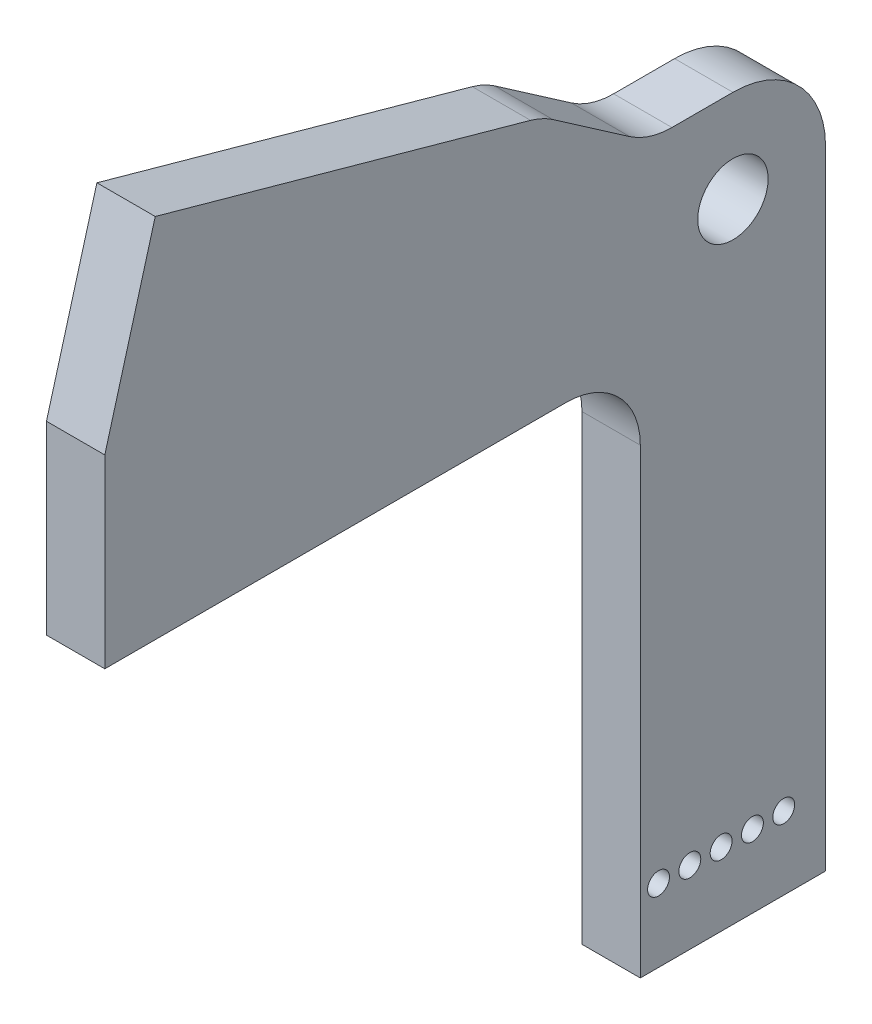
ISO-10303-21;
HEADER;
FILE_DESCRIPTION(('STEP AP214'),'2;1');
FILE_NAME('part.step','',(''),(''),'','','');
FILE_SCHEMA(('AUTOMOTIVE_DESIGN { 1 0 10303 214 1 1 1 1 }'));
ENDSEC;
DATA;
#1=APPLICATION_CONTEXT('core data for automotive mechanical design processes');
#2=APPLICATION_PROTOCOL_DEFINITION('international standard','automotive_design',2000,#1);
#3=PRODUCT_CONTEXT('',#1,'mechanical');
#4=PRODUCT('Part','Part','',(#3));
#5=PRODUCT_RELATED_PRODUCT_CATEGORY('part','',(#4));
#6=PRODUCT_DEFINITION_FORMATION('','',#4);
#7=PRODUCT_DEFINITION_CONTEXT('part definition',#1,'design');
#8=PRODUCT_DEFINITION('design','',#6,#7);
#9=PRODUCT_DEFINITION_SHAPE('','',#8);
#10=(LENGTH_UNIT() NAMED_UNIT(*) SI_UNIT(.MILLI.,.METRE.));
#11=(NAMED_UNIT(*) PLANE_ANGLE_UNIT() SI_UNIT($,.RADIAN.));
#12=(NAMED_UNIT(*) SI_UNIT($,.STERADIAN.) SOLID_ANGLE_UNIT());
#13=UNCERTAINTY_MEASURE_WITH_UNIT(LENGTH_MEASURE(1.E-05),#10,'distance_accuracy_value','');
#14=(GEOMETRIC_REPRESENTATION_CONTEXT(3) GLOBAL_UNCERTAINTY_ASSIGNED_CONTEXT((#13)) GLOBAL_UNIT_ASSIGNED_CONTEXT((#10,
#11,#12)) REPRESENTATION_CONTEXT('',''));
#15=CARTESIAN_POINT('',(0.,0.,0.));
#16=DIRECTION('',(0.,0.,1.));
#17=DIRECTION('',(1.,0.,0.));
#18=AXIS2_PLACEMENT_3D('',#15,#16,#17);
#19=CARTESIAN_POINT('',(2.,1.59130853302584,-1.10220376454605));
#20=DIRECTION('',(0.,0.8220643664474,-0.569394570941306));
#21=DIRECTION('',(0.,0.569394570941306,0.8220643664474));
#22=AXIS2_PLACEMENT_3D('',#19,#20,#21);
#23=PLANE('',#22);
#24=DIRECTION('',(0.,-0.569394570941306,-0.8220643664474));
#25=VECTOR('',#24,1.);
#26=CARTESIAN_POINT('',(-2.,1.59130853302584,-1.10220376454605));
#27=LINE('',#26,#25);
#28=CARTESIAN_POINT('',(-2.,10.9025666005929,12.3409406818238));
#29=VERTEX_POINT('',#28);
#30=CARTESIAN_POINT('',(-2.,7.2539130184472,7.07319095524302));
#31=VERTEX_POINT('',#30);
#32=EDGE_CURVE('E178',#29,#31,#27,.T.);
#33=ORIENTED_EDGE('',*,*,#32,.F.);
#34=DIRECTION('',(-1.,0.,0.));
#35=VECTOR('',#34,1.);
#36=CARTESIAN_POINT('',(2.,10.9025666005929,12.3409406818238));
#37=LINE('',#36,#35);
#38=CARTESIAN_POINT('',(2.,10.9025666005929,12.3409406818238));
#39=VERTEX_POINT('',#38);
#40=EDGE_CURVE('E11',#39,#29,#37,.T.);
#41=ORIENTED_EDGE('',*,*,#40,.F.);
#42=DIRECTION('',(0.,-0.569394570941306,-0.8220643664474));
#43=VECTOR('',#42,1.);
#44=CARTESIAN_POINT('',(2.,1.59130853302584,-1.10220376454605));
#45=LINE('',#44,#43);
#46=CARTESIAN_POINT('',(2.,7.2539130184472,7.07319095524302));
#47=VERTEX_POINT('',#46);
#48=EDGE_CURVE('E255',#39,#47,#45,.T.);
#49=ORIENTED_EDGE('',*,*,#48,.T.);
#50=DIRECTION('',(-1.,0.,0.));
#51=VECTOR('',#50,1.);
#52=CARTESIAN_POINT('',(2.,7.2539130184472,7.07319095524302));
#53=LINE('',#52,#51);
#54=EDGE_CURVE('E101',#47,#31,#53,.T.);
#55=ORIENTED_EDGE('',*,*,#54,.T.);
#56=EDGE_LOOP('',(#33,#41,#49,#55));
#57=FACE_BOUND('',#56,.T.);
#58=ADVANCED_FACE('F35',(#57),#23,.T.);
#59=CARTESIAN_POINT('',(2.,6.72647961904014,15.2334651022057));
#60=DIRECTION('',(-1.,0.,0.));
#61=DIRECTION('',(0.,0.,1.));
#62=AXIS2_PLACEMENT_3D('',#59,#60,#61);
#63=CYLINDRICAL_SURFACE('',#62,5.08);
#64=CARTESIAN_POINT('',(-2.,6.72647961904014,15.2334651022057));
#65=DIRECTION('',(1.,0.,0.));
#66=DIRECTION('',(0.,0.,-1.));
#67=AXIS2_PLACEMENT_3D('',#64,#65,#66);
#68=CIRCLE('',#67,5.08);
#69=CARTESIAN_POINT('',(-2.,11.6206352142722,13.8719802474757));
#70=VERTEX_POINT('',#69);
#71=EDGE_CURVE('E181',#29,#70,#68,.T.);
#72=ORIENTED_EDGE('',*,*,#71,.T.);
#73=DIRECTION('',(-1.,0.,0.));
#74=VECTOR('',#73,1.);
#75=CARTESIAN_POINT('',(2.,11.6206352142722,13.8719802474757));
#76=LINE('',#75,#74);
#77=CARTESIAN_POINT('',(2.,11.6206352142722,13.8719802474757));
#78=VERTEX_POINT('',#77);
#79=EDGE_CURVE('E44',#78,#70,#76,.T.);
#80=ORIENTED_EDGE('',*,*,#79,.F.);
#81=CARTESIAN_POINT('',(2.,6.72647961904014,15.2334651022057));
#82=DIRECTION('',(1.,0.,0.));
#83=DIRECTION('',(0.,0.,-1.));
#84=AXIS2_PLACEMENT_3D('',#81,#82,#83);
#85=CIRCLE('',#84,5.08);
#86=EDGE_CURVE('E251',#39,#78,#85,.T.);
#87=ORIENTED_EDGE('',*,*,#86,.F.);
#88=ORIENTED_EDGE('',*,*,#40,.T.);
#89=EDGE_LOOP('',(#72,#80,#87,#88));
#90=FACE_BOUND('',#89,.T.);
#91=ADVANCED_FACE('F239',(#90),#63,.T.);
#92=CARTESIAN_POINT('',(2.,7.20413730474607,-2.00408908972212));
#93=DIRECTION('',(0.,0.963416455754335,-0.268008829671254));
#94=DIRECTION('',(0.,0.268008829671254,0.963416455754335));
#95=AXIS2_PLACEMENT_3D('',#92,#93,#94);
#96=PLANE('',#95);
#97=DIRECTION('',(0.,-0.268008829671254,-0.963416455754335));
#98=VECTOR('',#97,1.);
#99=CARTESIAN_POINT('',(-2.,7.20413730474607,-2.00408908972212));
#100=LINE('',#99,#98);
#101=CARTESIAN_POINT('',(-2.,18.7801066646962,39.6082689298396));
#102=VERTEX_POINT('',#101);
#103=EDGE_CURVE('E184',#102,#70,#100,.T.);
#104=ORIENTED_EDGE('',*,*,#103,.F.);
#105=DIRECTION('',(-1.,0.,0.));
#106=VECTOR('',#105,1.);
#107=CARTESIAN_POINT('',(2.,18.7801066646962,39.6082689298396));
#108=LINE('',#107,#106);
#109=CARTESIAN_POINT('',(2.,18.7801066646962,39.6082689298396));
#110=VERTEX_POINT('',#109);
#111=EDGE_CURVE('E229',#110,#102,#108,.T.);
#112=ORIENTED_EDGE('',*,*,#111,.F.);
#113=DIRECTION('',(0.,-0.268008829671254,-0.963416455754335));
#114=VECTOR('',#113,1.);
#115=CARTESIAN_POINT('',(2.,7.20413730474607,-2.00408908972212));
#116=LINE('',#115,#114);
#117=EDGE_CURVE('E236',#110,#78,#116,.T.);
#118=ORIENTED_EDGE('',*,*,#117,.T.);
#119=ORIENTED_EDGE('',*,*,#79,.T.);
#120=EDGE_LOOP('',(#104,#112,#118,#119));
#121=FACE_BOUND('',#120,.T.);
#122=ADVANCED_FACE('F234',(#121),#96,.T.);
#123=CARTESIAN_POINT('',(2.,11.5759693599502,41.6123580195617));
#124=DIRECTION('',(0.,0.268008829671254,0.963416455754335));
#125=DIRECTION('',(0.,-0.963416455754335,0.268008829671254));
#126=AXIS2_PLACEMENT_3D('',#123,#124,#125);
#127=PLANE('',#126);
#128=DIRECTION('',(0.,0.963416455754335,-0.268008829671254));
#129=VECTOR('',#128,1.);
#130=CARTESIAN_POINT('',(-2.,11.5759693599502,41.6123580195617));
#131=LINE('',#130,#129);
#132=CARTESIAN_POINT('',(-2.,6.35,43.0661487698572));
#133=VERTEX_POINT('',#132);
#134=EDGE_CURVE('E187',#133,#102,#131,.T.);
#135=ORIENTED_EDGE('',*,*,#134,.F.);
#136=DIRECTION('',(-1.,0.,0.));
#137=VECTOR('',#136,1.);
#138=CARTESIAN_POINT('',(2.,6.35,43.0661487698572));
#139=LINE('',#138,#137);
#140=CARTESIAN_POINT('',(2.,6.35,43.0661487698572));
#141=VERTEX_POINT('',#140);
#142=EDGE_CURVE('E227',#141,#133,#139,.T.);
#143=ORIENTED_EDGE('',*,*,#142,.F.);
#144=DIRECTION('',(0.,0.963416455754335,-0.268008829671254));
#145=VECTOR('',#144,1.);
#146=CARTESIAN_POINT('',(2.,11.5759693599502,41.6123580195617));
#147=LINE('',#146,#145);
#148=EDGE_CURVE('E248',#141,#110,#147,.T.);
#149=ORIENTED_EDGE('',*,*,#148,.T.);
#150=ORIENTED_EDGE('',*,*,#111,.T.);
#151=EDGE_LOOP('',(#135,#143,#149,#150));
#152=FACE_BOUND('',#151,.T.);
#153=ADVANCED_FACE('F245',(#152),#127,.T.);
#154=CARTESIAN_POINT('',(2.,0.,43.0661487698572));
#155=DIRECTION('',(0.,0.,1.));
#156=DIRECTION('',(1.,0.,0.));
#157=AXIS2_PLACEMENT_3D('',#154,#155,#156);
#158=PLANE('',#157);
#159=DIRECTION('',(0.,1.,0.));
#160=VECTOR('',#159,1.);
#161=CARTESIAN_POINT('',(-2.,0.,43.0661487698572));
#162=LINE('',#161,#160);
#163=CARTESIAN_POINT('',(-2.,-6.35,43.0661487698572));
#164=VERTEX_POINT('',#163);
#165=EDGE_CURVE('E190',#164,#133,#162,.T.);
#166=ORIENTED_EDGE('',*,*,#165,.F.);
#167=DIRECTION('',(-1.,0.,0.));
#168=VECTOR('',#167,1.);
#169=CARTESIAN_POINT('',(2.,-6.35,43.0661487698572));
#170=LINE('',#169,#168);
#171=CARTESIAN_POINT('',(2.,-6.35,43.0661487698572));
#172=VERTEX_POINT('',#171);
#173=EDGE_CURVE('E225',#172,#164,#170,.T.);
#174=ORIENTED_EDGE('',*,*,#173,.F.);
#175=DIRECTION('',(0.,1.,0.));
#176=VECTOR('',#175,1.);
#177=CARTESIAN_POINT('',(2.,0.,43.0661487698572));
#178=LINE('',#177,#176);
#179=EDGE_CURVE('E253',#172,#141,#178,.T.);
#180=ORIENTED_EDGE('',*,*,#179,.T.);
#181=ORIENTED_EDGE('',*,*,#142,.T.);
#182=EDGE_LOOP('',(#166,#174,#180,#181));
#183=FACE_BOUND('',#182,.T.);
#184=ADVANCED_FACE('F386',(#183),#158,.T.);
#185=CARTESIAN_POINT('',(2.,-6.35,0.));
#186=DIRECTION('',(0.,-1.,0.));
#187=DIRECTION('',(0.,0.,-1.));
#188=AXIS2_PLACEMENT_3D('',#185,#186,#187);
#189=PLANE('',#188);
#190=DIRECTION('',(0.,0.,1.));
#191=VECTOR('',#190,1.);
#192=CARTESIAN_POINT('',(-2.,-6.35,0.));
#193=LINE('',#192,#191);
#194=CARTESIAN_POINT('',(-2.,-6.35,11.43));
#195=VERTEX_POINT('',#194);
#196=EDGE_CURVE('E193',#195,#164,#193,.T.);
#197=ORIENTED_EDGE('',*,*,#196,.F.);
#198=DIRECTION('',(-1.,0.,0.));
#199=VECTOR('',#198,1.);
#200=CARTESIAN_POINT('',(2.,-6.35,11.43));
#201=LINE('',#200,#199);
#202=CARTESIAN_POINT('',(2.,-6.35,11.43));
#203=VERTEX_POINT('',#202);
#204=EDGE_CURVE('E223',#203,#195,#201,.T.);
#205=ORIENTED_EDGE('',*,*,#204,.F.);
#206=DIRECTION('',(0.,0.,1.));
#207=VECTOR('',#206,1.);
#208=CARTESIAN_POINT('',(2.,-6.35,0.));
#209=LINE('',#208,#207);
#210=EDGE_CURVE('E260',#203,#172,#209,.T.);
#211=ORIENTED_EDGE('',*,*,#210,.T.);
#212=ORIENTED_EDGE('',*,*,#173,.T.);
#213=EDGE_LOOP('',(#197,#205,#211,#212));
#214=FACE_BOUND('',#213,.T.);
#215=ADVANCED_FACE('F382',(#214),#189,.T.);
#216=CARTESIAN_POINT('',(2.,-11.43,11.43));
#217=DIRECTION('',(-1.,0.,0.));
#218=DIRECTION('',(0.,0.,1.));
#219=AXIS2_PLACEMENT_3D('',#216,#217,#218);
#220=CYLINDRICAL_SURFACE('',#219,5.08);
#221=CARTESIAN_POINT('',(-2.,-11.43,11.43));
#222=DIRECTION('',(1.,0.,0.));
#223=DIRECTION('',(0.,0.,-1.));
#224=AXIS2_PLACEMENT_3D('',#221,#222,#223);
#225=CIRCLE('',#224,5.08);
#226=CARTESIAN_POINT('',(-2.,-11.43,6.35));
#227=VERTEX_POINT('',#226);
#228=EDGE_CURVE('E196',#227,#195,#225,.T.);
#229=ORIENTED_EDGE('',*,*,#228,.F.);
#230=DIRECTION('',(-1.,0.,0.));
#231=VECTOR('',#230,1.);
#232=CARTESIAN_POINT('',(2.,-11.43,6.35));
#233=LINE('',#232,#231);
#234=CARTESIAN_POINT('',(2.,-11.43,6.35));
#235=VERTEX_POINT('',#234);
#236=EDGE_CURVE('E221',#235,#227,#233,.T.);
#237=ORIENTED_EDGE('',*,*,#236,.F.);
#238=CARTESIAN_POINT('',(2.,-11.43,11.43));
#239=DIRECTION('',(1.,0.,0.));
#240=DIRECTION('',(0.,0.,-1.));
#241=AXIS2_PLACEMENT_3D('',#238,#239,#240);
#242=CIRCLE('',#241,5.08);
#243=EDGE_CURVE('E263',#235,#203,#242,.T.);
#244=ORIENTED_EDGE('',*,*,#243,.T.);
#245=ORIENTED_EDGE('',*,*,#204,.T.);
#246=EDGE_LOOP('',(#229,#237,#244,#245));
#247=FACE_BOUND('',#246,.T.);
#248=ADVANCED_FACE('F378',(#247),#220,.F.);
#249=CARTESIAN_POINT('',(2.,0.,6.35));
#250=DIRECTION('',(0.,0.,1.));
#251=DIRECTION('',(1.,0.,0.));
#252=AXIS2_PLACEMENT_3D('',#249,#250,#251);
#253=PLANE('',#252);
#254=DIRECTION('',(0.,1.,0.));
#255=VECTOR('',#254,1.);
#256=CARTESIAN_POINT('',(-2.,0.,6.35));
#257=LINE('',#256,#255);
#258=CARTESIAN_POINT('',(-2.,-43.0661487698572,6.35));
#259=VERTEX_POINT('',#258);
#260=EDGE_CURVE('E199',#259,#227,#257,.T.);
#261=ORIENTED_EDGE('',*,*,#260,.F.);
#262=DIRECTION('',(-1.,0.,0.));
#263=VECTOR('',#262,1.);
#264=CARTESIAN_POINT('',(2.,-43.0661487698572,6.35));
#265=LINE('',#264,#263);
#266=CARTESIAN_POINT('',(2.,-43.0661487698572,6.35));
#267=VERTEX_POINT('',#266);
#268=EDGE_CURVE('E219',#267,#259,#265,.T.);
#269=ORIENTED_EDGE('',*,*,#268,.F.);
#270=DIRECTION('',(0.,1.,0.));
#271=VECTOR('',#270,1.);
#272=CARTESIAN_POINT('',(2.,0.,6.35));
#273=LINE('',#272,#271);
#274=EDGE_CURVE('E266',#267,#235,#273,.T.);
#275=ORIENTED_EDGE('',*,*,#274,.T.);
#276=ORIENTED_EDGE('',*,*,#236,.T.);
#277=EDGE_LOOP('',(#261,#269,#275,#276));
#278=FACE_BOUND('',#277,.T.);
#279=ADVANCED_FACE('F374',(#278),#253,.T.);
#280=CARTESIAN_POINT('',(2.,-43.0661487698572,0.));
#281=DIRECTION('',(0.,-1.,0.));
#282=DIRECTION('',(0.,0.,-1.));
#283=AXIS2_PLACEMENT_3D('',#280,#281,#282);
#284=PLANE('',#283);
#285=DIRECTION('',(0.,0.,1.));
#286=VECTOR('',#285,1.);
#287=CARTESIAN_POINT('',(-2.,-43.0661487698572,0.));
#288=LINE('',#287,#286);
#289=CARTESIAN_POINT('',(-2.,-43.0661487698572,-6.35));
#290=VERTEX_POINT('',#289);
#291=EDGE_CURVE('E202',#290,#259,#288,.T.);
#292=ORIENTED_EDGE('',*,*,#291,.F.);
#293=DIRECTION('',(-1.,0.,0.));
#294=VECTOR('',#293,1.);
#295=CARTESIAN_POINT('',(2.,-43.0661487698572,-6.35));
#296=LINE('',#295,#294);
#297=CARTESIAN_POINT('',(2.,-43.0661487698572,-6.35));
#298=VERTEX_POINT('',#297);
#299=EDGE_CURVE('E217',#298,#290,#296,.T.);
#300=ORIENTED_EDGE('',*,*,#299,.F.);
#301=DIRECTION('',(0.,0.,1.));
#302=VECTOR('',#301,1.);
#303=CARTESIAN_POINT('',(2.,-43.0661487698572,0.));
#304=LINE('',#303,#302);
#305=EDGE_CURVE('E269',#298,#267,#304,.T.);
#306=ORIENTED_EDGE('',*,*,#305,.T.);
#307=ORIENTED_EDGE('',*,*,#268,.T.);
#308=EDGE_LOOP('',(#292,#300,#306,#307));
#309=FACE_BOUND('',#308,.T.);
#310=ADVANCED_FACE('F371',(#309),#284,.T.);
#311=CARTESIAN_POINT('',(2.,0.,-6.35));
#312=DIRECTION('',(0.,0.,-1.));
#313=DIRECTION('',(0.,1.,0.));
#314=AXIS2_PLACEMENT_3D('',#311,#312,#313);
#315=PLANE('',#314);
#316=DIRECTION('',(0.,-1.,0.));
#317=VECTOR('',#316,1.);
#318=CARTESIAN_POINT('',(-2.,0.,-6.35));
#319=LINE('',#318,#317);
#320=CARTESIAN_POINT('',(-2.,0.,-6.35));
#321=VERTEX_POINT('',#320);
#322=EDGE_CURVE('E205',#321,#290,#319,.T.);
#323=ORIENTED_EDGE('',*,*,#322,.F.);
#324=DIRECTION('',(-1.,0.,0.));
#325=VECTOR('',#324,1.);
#326=CARTESIAN_POINT('',(2.,0.,-6.35));
#327=LINE('',#326,#325);
#328=CARTESIAN_POINT('',(2.,0.,-6.35));
#329=VERTEX_POINT('',#328);
#330=EDGE_CURVE('E146',#329,#321,#327,.T.);
#331=ORIENTED_EDGE('',*,*,#330,.F.);
#332=DIRECTION('',(0.,-1.,0.));
#333=VECTOR('',#332,1.);
#334=CARTESIAN_POINT('',(2.,0.,-6.35));
#335=LINE('',#334,#333);
#336=EDGE_CURVE('E153',#329,#298,#335,.T.);
#337=ORIENTED_EDGE('',*,*,#336,.T.);
#338=ORIENTED_EDGE('',*,*,#299,.T.);
#339=EDGE_LOOP('',(#323,#331,#337,#338));
#340=FACE_BOUND('',#339,.T.);
#341=ADVANCED_FACE('F273',(#340),#315,.T.);
#342=CARTESIAN_POINT('',(2.,0.,0.));
#343=DIRECTION('',(-1.,0.,0.));
#344=DIRECTION('',(0.,0.,1.));
#345=AXIS2_PLACEMENT_3D('',#342,#343,#344);
#346=CYLINDRICAL_SURFACE('',#345,6.35);
#347=CARTESIAN_POINT('',(-2.,0.,0.));
#348=DIRECTION('',(1.,0.,0.));
#349=DIRECTION('',(0.,0.,-1.));
#350=AXIS2_PLACEMENT_3D('',#347,#348,#349);
#351=CIRCLE('',#350,6.35);
#352=CARTESIAN_POINT('',(-2.,6.35,0.));
#353=VERTEX_POINT('',#352);
#354=EDGE_CURVE('E141',#353,#321,#351,.F.);
#355=ORIENTED_EDGE('',*,*,#354,.F.);
#356=DIRECTION('',(-1.,0.,0.));
#357=VECTOR('',#356,1.);
#358=CARTESIAN_POINT('',(2.,6.35,0.));
#359=LINE('',#358,#357);
#360=CARTESIAN_POINT('',(2.,6.35,0.));
#361=VERTEX_POINT('',#360);
#362=EDGE_CURVE('E136',#361,#353,#359,.T.);
#363=ORIENTED_EDGE('',*,*,#362,.F.);
#364=CARTESIAN_POINT('',(2.,0.,0.));
#365=DIRECTION('',(1.,0.,0.));
#366=DIRECTION('',(0.,0.,-1.));
#367=AXIS2_PLACEMENT_3D('',#364,#365,#366);
#368=CIRCLE('',#367,6.35);
#369=EDGE_CURVE('E139',#361,#329,#368,.F.);
#370=ORIENTED_EDGE('',*,*,#369,.T.);
#371=ORIENTED_EDGE('',*,*,#330,.T.);
#372=EDGE_LOOP('',(#355,#363,#370,#371));
#373=FACE_BOUND('',#372,.T.);
#374=ADVANCED_FACE('F138',(#373),#346,.T.);
#375=CARTESIAN_POINT('',(2.,6.35,0.));
#376=DIRECTION('',(0.,1.,0.));
#377=DIRECTION('',(0.,0.,1.));
#378=AXIS2_PLACEMENT_3D('',#375,#376,#377);
#379=PLANE('',#378);
#380=DIRECTION('',(0.,0.,-1.));
#381=VECTOR('',#380,1.);
#382=CARTESIAN_POINT('',(-2.,6.35,0.));
#383=LINE('',#382,#381);
#384=CARTESIAN_POINT('',(-2.,6.35,4.18066653486117));
#385=VERTEX_POINT('',#384);
#386=EDGE_CURVE('E209',#385,#353,#383,.T.);
#387=ORIENTED_EDGE('',*,*,#386,.F.);
#388=DIRECTION('',(-1.,0.,0.));
#389=VECTOR('',#388,1.);
#390=CARTESIAN_POINT('',(2.,6.35,4.18066653486117));
#391=LINE('',#390,#389);
#392=CARTESIAN_POINT('',(2.,6.35,4.18066653486117));
#393=VERTEX_POINT('',#392);
#394=EDGE_CURVE('E94',#393,#385,#391,.T.);
#395=ORIENTED_EDGE('',*,*,#394,.F.);
#396=DIRECTION('',(0.,0.,-1.));
#397=VECTOR('',#396,1.);
#398=CARTESIAN_POINT('',(2.,6.35,0.));
#399=LINE('',#398,#397);
#400=EDGE_CURVE('E150',#393,#361,#399,.T.);
#401=ORIENTED_EDGE('',*,*,#400,.T.);
#402=ORIENTED_EDGE('',*,*,#362,.T.);
#403=EDGE_LOOP('',(#387,#395,#401,#402));
#404=FACE_BOUND('',#403,.T.);
#405=ADVANCED_FACE('F155',(#404),#379,.T.);
#406=CARTESIAN_POINT('',(2.,-38.0661487698572,-3.48181818181819));
#407=DIRECTION('',(-1.,0.,0.));
#408=DIRECTION('',(0.,0.,1.));
#409=AXIS2_PLACEMENT_3D('',#406,#407,#408);
#410=CYLINDRICAL_SURFACE('',#409,0.750000000000001);
#411=CARTESIAN_POINT('',(2.,-38.0661487698572,-3.48181818181819));
#412=DIRECTION('',(1.,0.,0.));
#413=DIRECTION('',(0.,0.,-1.));
#414=AXIS2_PLACEMENT_3D('',#411,#412,#413);
#415=CIRCLE('',#414,0.750000000000001);
#416=CARTESIAN_POINT('',(2.,-38.0661487698572,-4.23181818181819));
#417=VERTEX_POINT('',#416);
#418=EDGE_CURVE('E276',#417,#417,#415,.T.);
#419=ORIENTED_EDGE('',*,*,#418,.T.);
#420=EDGE_LOOP('',(#419));
#421=FACE_BOUND('',#420,.T.);
#422=CARTESIAN_POINT('',(-2.,-38.0661487698572,-3.48181818181819));
#423=DIRECTION('',(1.,0.,0.));
#424=DIRECTION('',(0.,0.,-1.));
#425=AXIS2_PLACEMENT_3D('',#422,#423,#424);
#426=CIRCLE('',#425,0.750000000000001);
#427=CARTESIAN_POINT('',(-2.,-38.0661487698572,-4.23181818181819));
#428=VERTEX_POINT('',#427);
#429=EDGE_CURVE('E175',#428,#428,#426,.T.);
#430=ORIENTED_EDGE('',*,*,#429,.F.);
#431=EDGE_LOOP('',(#430));
#432=FACE_BOUND('',#431,.T.);
#433=ADVANCED_FACE('F310',(#421,#432),#410,.F.);
#434=CARTESIAN_POINT('',(2.,-38.0661487698572,-1.33636363636364));
#435=DIRECTION('',(-1.,0.,0.));
#436=DIRECTION('',(0.,0.,1.));
#437=AXIS2_PLACEMENT_3D('',#434,#435,#436);
#438=CYLINDRICAL_SURFACE('',#437,0.750000000000001);
#439=CARTESIAN_POINT('',(2.,-38.0661487698572,-1.33636363636364));
#440=DIRECTION('',(1.,0.,0.));
#441=DIRECTION('',(0.,0.,-1.));
#442=AXIS2_PLACEMENT_3D('',#439,#440,#441);
#443=CIRCLE('',#442,0.750000000000001);
#444=CARTESIAN_POINT('',(2.,-38.0661487698572,-2.08636363636364));
#445=VERTEX_POINT('',#444);
#446=EDGE_CURVE('E278',#445,#445,#443,.T.);
#447=ORIENTED_EDGE('',*,*,#446,.T.);
#448=EDGE_LOOP('',(#447));
#449=FACE_BOUND('',#448,.T.);
#450=CARTESIAN_POINT('',(-2.,-38.0661487698572,-1.33636363636364));
#451=DIRECTION('',(1.,0.,0.));
#452=DIRECTION('',(0.,0.,-1.));
#453=AXIS2_PLACEMENT_3D('',#450,#451,#452);
#454=CIRCLE('',#453,0.750000000000001);
#455=CARTESIAN_POINT('',(-2.,-38.0661487698572,-2.08636363636364));
#456=VERTEX_POINT('',#455);
#457=EDGE_CURVE('E172',#456,#456,#454,.T.);
#458=ORIENTED_EDGE('',*,*,#457,.F.);
#459=EDGE_LOOP('',(#458));
#460=FACE_BOUND('',#459,.T.);
#461=ADVANCED_FACE('F313',(#449,#460),#438,.F.);
#462=CARTESIAN_POINT('',(2.,-38.0661487698572,0.809090909090904));
#463=DIRECTION('',(-1.,0.,0.));
#464=DIRECTION('',(0.,0.,1.));
#465=AXIS2_PLACEMENT_3D('',#462,#463,#464);
#466=CYLINDRICAL_SURFACE('',#465,0.750000000000001);
#467=CARTESIAN_POINT('',(2.,-38.0661487698572,0.809090909090904));
#468=DIRECTION('',(1.,0.,0.));
#469=DIRECTION('',(0.,0.,-1.));
#470=AXIS2_PLACEMENT_3D('',#467,#468,#469);
#471=CIRCLE('',#470,0.750000000000001);
#472=CARTESIAN_POINT('',(2.,-38.0661487698572,0.0590909090909031));
#473=VERTEX_POINT('',#472);
#474=EDGE_CURVE('E283',#473,#473,#471,.T.);
#475=ORIENTED_EDGE('',*,*,#474,.T.);
#476=EDGE_LOOP('',(#475));
#477=FACE_BOUND('',#476,.T.);
#478=CARTESIAN_POINT('',(-2.,-38.0661487698572,0.809090909090904));
#479=DIRECTION('',(1.,0.,0.));
#480=DIRECTION('',(0.,0.,-1.));
#481=AXIS2_PLACEMENT_3D('',#478,#479,#480);
#482=CIRCLE('',#481,0.750000000000001);
#483=CARTESIAN_POINT('',(-2.,-38.0661487698572,0.0590909090909031));
#484=VERTEX_POINT('',#483);
#485=EDGE_CURVE('E169',#484,#484,#482,.T.);
#486=ORIENTED_EDGE('',*,*,#485,.F.);
#487=EDGE_LOOP('',(#486));
#488=FACE_BOUND('',#487,.T.);
#489=ADVANCED_FACE('F334',(#477,#488),#466,.F.);
#490=CARTESIAN_POINT('',(2.,-38.0661487698572,2.95454545454545));
#491=DIRECTION('',(-1.,0.,0.));
#492=DIRECTION('',(0.,0.,1.));
#493=AXIS2_PLACEMENT_3D('',#490,#491,#492);
#494=CYLINDRICAL_SURFACE('',#493,0.750000000000001);
#495=CARTESIAN_POINT('',(2.,-38.0661487698572,2.95454545454545));
#496=DIRECTION('',(1.,0.,0.));
#497=DIRECTION('',(0.,0.,-1.));
#498=AXIS2_PLACEMENT_3D('',#495,#496,#497);
#499=CIRCLE('',#498,0.750000000000001);
#500=CARTESIAN_POINT('',(2.,-38.0661487698572,2.20454545454545));
#501=VERTEX_POINT('',#500);
#502=EDGE_CURVE('E286',#501,#501,#499,.T.);
#503=ORIENTED_EDGE('',*,*,#502,.T.);
#504=EDGE_LOOP('',(#503));
#505=FACE_BOUND('',#504,.T.);
#506=CARTESIAN_POINT('',(-2.,-38.0661487698572,2.95454545454545));
#507=DIRECTION('',(1.,0.,0.));
#508=DIRECTION('',(0.,0.,-1.));
#509=AXIS2_PLACEMENT_3D('',#506,#507,#508);
#510=CIRCLE('',#509,0.750000000000001);
#511=CARTESIAN_POINT('',(-2.,-38.0661487698572,2.20454545454545));
#512=VERTEX_POINT('',#511);
#513=EDGE_CURVE('E166',#512,#512,#510,.T.);
#514=ORIENTED_EDGE('',*,*,#513,.F.);
#515=EDGE_LOOP('',(#514));
#516=FACE_BOUND('',#515,.T.);
#517=ADVANCED_FACE('F338',(#505,#516),#494,.F.);
#518=CARTESIAN_POINT('',(2.,-38.0661487698572,5.1));
#519=DIRECTION('',(-1.,0.,0.));
#520=DIRECTION('',(0.,0.,1.));
#521=AXIS2_PLACEMENT_3D('',#518,#519,#520);
#522=CYLINDRICAL_SURFACE('',#521,0.750000000000001);
#523=CARTESIAN_POINT('',(2.,-38.0661487698572,5.1));
#524=DIRECTION('',(1.,0.,0.));
#525=DIRECTION('',(0.,0.,-1.));
#526=AXIS2_PLACEMENT_3D('',#523,#524,#525);
#527=CIRCLE('',#526,0.750000000000001);
#528=CARTESIAN_POINT('',(2.,-38.0661487698572,4.34999999999999));
#529=VERTEX_POINT('',#528);
#530=EDGE_CURVE('E289',#529,#529,#527,.T.);
#531=ORIENTED_EDGE('',*,*,#530,.T.);
#532=EDGE_LOOP('',(#531));
#533=FACE_BOUND('',#532,.T.);
#534=CARTESIAN_POINT('',(-2.,-38.0661487698572,5.1));
#535=DIRECTION('',(1.,0.,0.));
#536=DIRECTION('',(0.,0.,-1.));
#537=AXIS2_PLACEMENT_3D('',#534,#535,#536);
#538=CIRCLE('',#537,0.750000000000001);
#539=CARTESIAN_POINT('',(-2.,-38.0661487698572,4.34999999999999));
#540=VERTEX_POINT('',#539);
#541=EDGE_CURVE('E163',#540,#540,#538,.T.);
#542=ORIENTED_EDGE('',*,*,#541,.F.);
#543=EDGE_LOOP('',(#542));
#544=FACE_BOUND('',#543,.T.);
#545=ADVANCED_FACE('F341',(#533,#544),#522,.F.);
#546=CARTESIAN_POINT('',(2.,0.,0.));
#547=DIRECTION('',(-1.,0.,0.));
#548=DIRECTION('',(0.,0.,1.));
#549=AXIS2_PLACEMENT_3D('',#546,#547,#548);
#550=CYLINDRICAL_SURFACE('',#549,2.413);
#551=CARTESIAN_POINT('',(2.,0.,0.));
#552=DIRECTION('',(1.,0.,0.));
#553=DIRECTION('',(0.,0.,-1.));
#554=AXIS2_PLACEMENT_3D('',#551,#552,#553);
#555=CIRCLE('',#554,2.413);
#556=CARTESIAN_POINT('',(2.,0.,-2.413));
#557=VERTEX_POINT('',#556);
#558=EDGE_CURVE('E213',#557,#557,#555,.T.);
#559=ORIENTED_EDGE('',*,*,#558,.T.);
#560=EDGE_LOOP('',(#559));
#561=FACE_BOUND('',#560,.T.);
#562=CARTESIAN_POINT('',(-2.,0.,0.));
#563=DIRECTION('',(1.,0.,0.));
#564=DIRECTION('',(0.,0.,-1.));
#565=AXIS2_PLACEMENT_3D('',#562,#563,#564);
#566=CIRCLE('',#565,2.413);
#567=CARTESIAN_POINT('',(-2.,0.,-2.413));
#568=VERTEX_POINT('',#567);
#569=EDGE_CURVE('E160',#568,#568,#566,.T.);
#570=ORIENTED_EDGE('',*,*,#569,.F.);
#571=EDGE_LOOP('',(#570));
#572=FACE_BOUND('',#571,.T.);
#573=ADVANCED_FACE('F37',(#561,#572),#550,.F.);
#574=CARTESIAN_POINT('',(2.,11.43,4.18066653486119));
#575=DIRECTION('',(-1.,0.,0.));
#576=DIRECTION('',(0.,0.,1.));
#577=AXIS2_PLACEMENT_3D('',#574,#575,#576);
#578=CYLINDRICAL_SURFACE('',#577,5.08);
#579=CARTESIAN_POINT('',(-2.,11.43,4.18066653486119));
#580=DIRECTION('',(1.,0.,0.));
#581=DIRECTION('',(0.,0.,-1.));
#582=AXIS2_PLACEMENT_3D('',#579,#580,#581);
#583=CIRCLE('',#582,5.08);
#584=EDGE_CURVE('E211',#385,#31,#583,.F.);
#585=ORIENTED_EDGE('',*,*,#584,.T.);
#586=ORIENTED_EDGE('',*,*,#54,.F.);
#587=CARTESIAN_POINT('',(2.,11.43,4.18066653486119));
#588=DIRECTION('',(1.,0.,0.));
#589=DIRECTION('',(0.,0.,-1.));
#590=AXIS2_PLACEMENT_3D('',#587,#588,#589);
#591=CIRCLE('',#590,5.08);
#592=EDGE_CURVE('E52',#393,#47,#591,.F.);
#593=ORIENTED_EDGE('',*,*,#592,.F.);
#594=ORIENTED_EDGE('',*,*,#394,.T.);
#595=EDGE_LOOP('',(#585,#586,#593,#594));
#596=FACE_BOUND('',#595,.T.);
#597=ADVANCED_FACE('F275',(#596),#578,.F.);
#598=CARTESIAN_POINT('',(2.,0.,0.));
#599=DIRECTION('',(1.,0.,0.));
#600=DIRECTION('',(0.,0.,-1.));
#601=AXIS2_PLACEMENT_3D('',#598,#599,#600);
#602=PLANE('',#601);
#603=ORIENTED_EDGE('',*,*,#558,.F.);
#604=EDGE_LOOP('',(#603));
#605=FACE_BOUND('',#604,.T.);
#606=ORIENTED_EDGE('',*,*,#530,.F.);
#607=EDGE_LOOP('',(#606));
#608=FACE_BOUND('',#607,.T.);
#609=ORIENTED_EDGE('',*,*,#502,.F.);
#610=EDGE_LOOP('',(#609));
#611=FACE_BOUND('',#610,.T.);
#612=ORIENTED_EDGE('',*,*,#474,.F.);
#613=EDGE_LOOP('',(#612));
#614=FACE_BOUND('',#613,.T.);
#615=ORIENTED_EDGE('',*,*,#446,.F.);
#616=EDGE_LOOP('',(#615));
#617=FACE_BOUND('',#616,.T.);
#618=ORIENTED_EDGE('',*,*,#418,.F.);
#619=EDGE_LOOP('',(#618));
#620=FACE_BOUND('',#619,.T.);
#621=ORIENTED_EDGE('',*,*,#48,.F.);
#622=ORIENTED_EDGE('',*,*,#86,.T.);
#623=ORIENTED_EDGE('',*,*,#117,.F.);
#624=ORIENTED_EDGE('',*,*,#148,.F.);
#625=ORIENTED_EDGE('',*,*,#179,.F.);
#626=ORIENTED_EDGE('',*,*,#210,.F.);
#627=ORIENTED_EDGE('',*,*,#243,.F.);
#628=ORIENTED_EDGE('',*,*,#274,.F.);
#629=ORIENTED_EDGE('',*,*,#305,.F.);
#630=ORIENTED_EDGE('',*,*,#336,.F.);
#631=ORIENTED_EDGE('',*,*,#369,.F.);
#632=ORIENTED_EDGE('',*,*,#400,.F.);
#633=ORIENTED_EDGE('',*,*,#592,.T.);
#634=EDGE_LOOP('',(#621,#622,#623,#624,#625,#626,#627,#628,#629,#630,#631,#632,#633));
#635=FACE_BOUND('',#634,.T.);
#636=ADVANCED_FACE('F149',(#605,#608,#611,#614,#617,#620,#635),#602,.T.);
#637=CARTESIAN_POINT('',(-2.,0.,0.));
#638=DIRECTION('',(1.,0.,0.));
#639=DIRECTION('',(0.,0.,-1.));
#640=AXIS2_PLACEMENT_3D('',#637,#638,#639);
#641=PLANE('',#640);
#642=ORIENTED_EDGE('',*,*,#569,.T.);
#643=EDGE_LOOP('',(#642));
#644=FACE_BOUND('',#643,.T.);
#645=ORIENTED_EDGE('',*,*,#541,.T.);
#646=EDGE_LOOP('',(#645));
#647=FACE_BOUND('',#646,.T.);
#648=ORIENTED_EDGE('',*,*,#513,.T.);
#649=EDGE_LOOP('',(#648));
#650=FACE_BOUND('',#649,.T.);
#651=ORIENTED_EDGE('',*,*,#485,.T.);
#652=EDGE_LOOP('',(#651));
#653=FACE_BOUND('',#652,.T.);
#654=ORIENTED_EDGE('',*,*,#457,.T.);
#655=EDGE_LOOP('',(#654));
#656=FACE_BOUND('',#655,.T.);
#657=ORIENTED_EDGE('',*,*,#429,.T.);
#658=EDGE_LOOP('',(#657));
#659=FACE_BOUND('',#658,.T.);
#660=ORIENTED_EDGE('',*,*,#32,.T.);
#661=ORIENTED_EDGE('',*,*,#584,.F.);
#662=ORIENTED_EDGE('',*,*,#386,.T.);
#663=ORIENTED_EDGE('',*,*,#354,.T.);
#664=ORIENTED_EDGE('',*,*,#322,.T.);
#665=ORIENTED_EDGE('',*,*,#291,.T.);
#666=ORIENTED_EDGE('',*,*,#260,.T.);
#667=ORIENTED_EDGE('',*,*,#228,.T.);
#668=ORIENTED_EDGE('',*,*,#196,.T.);
#669=ORIENTED_EDGE('',*,*,#165,.T.);
#670=ORIENTED_EDGE('',*,*,#134,.T.);
#671=ORIENTED_EDGE('',*,*,#103,.T.);
#672=ORIENTED_EDGE('',*,*,#71,.F.);
#673=EDGE_LOOP('',(#660,#661,#662,#663,#664,#665,#666,#667,#668,#669,#670,#671,#672));
#674=FACE_BOUND('',#673,.T.);
#675=ADVANCED_FACE('F241',(#644,#647,#650,#653,#656,#659,#674),#641,.F.);
#676=CLOSED_SHELL('',(#58,#91,#122,#153,#184,#215,#248,#279,#310,#341,#374,#405,#433,#461,#489,
#517,#545,#573,#597,#636,#675));
#677=MANIFOLD_SOLID_BREP('B2',#676);
#678=ADVANCED_BREP_SHAPE_REPRESENTATION('',(#18,#677),#14);
#679=SHAPE_DEFINITION_REPRESENTATION(#9,#678);
ENDSEC;
END-ISO-10303-21;
